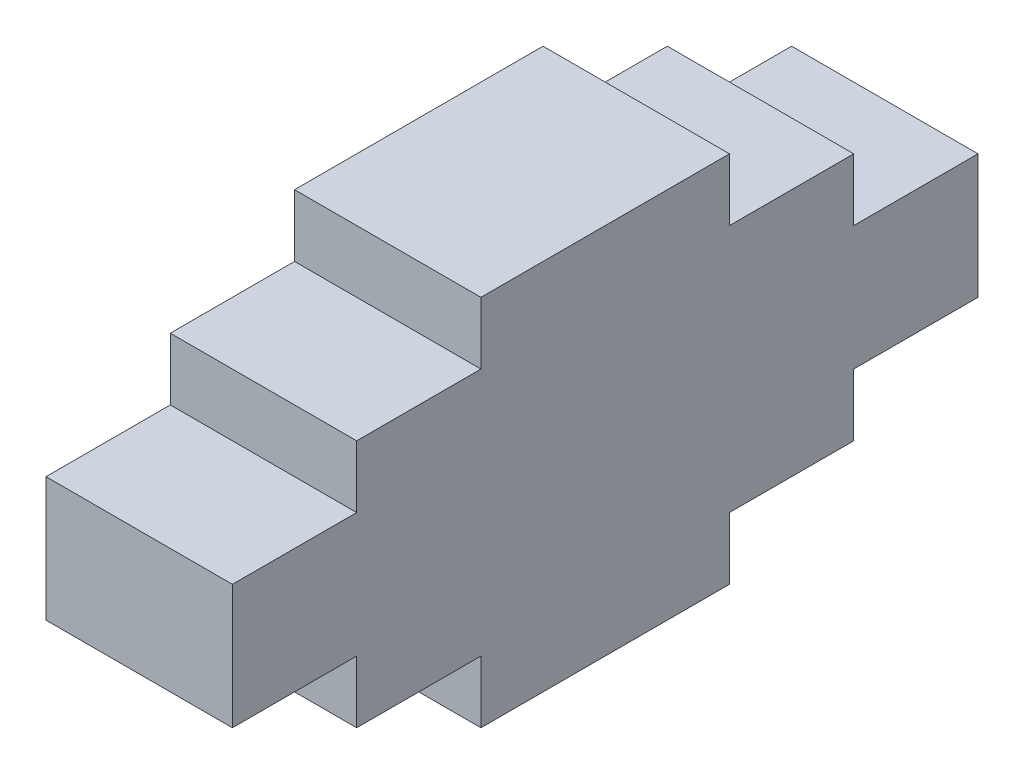
ISO-10303-21;
HEADER;
FILE_DESCRIPTION(('STEP AP214'),'2;1');
FILE_NAME('part.step','',(''),(''),'','','');
FILE_SCHEMA(('AUTOMOTIVE_DESIGN { 1 0 10303 214 1 1 1 1 }'));
ENDSEC;
DATA;
#1=APPLICATION_CONTEXT('core data for automotive mechanical design processes');
#2=APPLICATION_PROTOCOL_DEFINITION('international standard','automotive_design',2000,#1);
#3=PRODUCT_CONTEXT('',#1,'mechanical');
#4=PRODUCT('Part','Part','',(#3));
#5=PRODUCT_RELATED_PRODUCT_CATEGORY('part','',(#4));
#6=PRODUCT_DEFINITION_FORMATION('','',#4);
#7=PRODUCT_DEFINITION_CONTEXT('part definition',#1,'design');
#8=PRODUCT_DEFINITION('design','',#6,#7);
#9=PRODUCT_DEFINITION_SHAPE('','',#8);
#10=(LENGTH_UNIT() NAMED_UNIT(*) SI_UNIT(.MILLI.,.METRE.));
#11=(NAMED_UNIT(*) PLANE_ANGLE_UNIT() SI_UNIT($,.RADIAN.));
#12=(NAMED_UNIT(*) SI_UNIT($,.STERADIAN.) SOLID_ANGLE_UNIT());
#13=UNCERTAINTY_MEASURE_WITH_UNIT(LENGTH_MEASURE(1.E-05),#10,'distance_accuracy_value','');
#14=(GEOMETRIC_REPRESENTATION_CONTEXT(3) GLOBAL_UNCERTAINTY_ASSIGNED_CONTEXT((#13)) GLOBAL_UNIT_ASSIGNED_CONTEXT((#10,
#11,#12)) REPRESENTATION_CONTEXT('',''));
#15=CARTESIAN_POINT('',(0.,0.,0.));
#16=DIRECTION('',(0.,0.,1.));
#17=DIRECTION('',(1.,0.,0.));
#18=AXIS2_PLACEMENT_3D('',#15,#16,#17);
#19=CARTESIAN_POINT('',(30.,10.,60.));
#20=DIRECTION('',(0.,-1.,0.));
#21=DIRECTION('',(0.,0.,-1.));
#22=AXIS2_PLACEMENT_3D('',#19,#20,#21);
#23=PLANE('',#22);
#24=DIRECTION('',(0.,0.,1.));
#25=VECTOR('',#24,1.);
#26=CARTESIAN_POINT('',(0.,10.,60.));
#27=LINE('',#26,#25);
#28=CARTESIAN_POINT('',(0.,10.,40.));
#29=VERTEX_POINT('',#28);
#30=CARTESIAN_POINT('',(0.,10.,60.));
#31=VERTEX_POINT('',#30);
#32=EDGE_CURVE('E212',#29,#31,#27,.T.);
#33=ORIENTED_EDGE('',*,*,#32,.T.);
#34=DIRECTION('',(-1.,0.,0.));
#35=VECTOR('',#34,1.);
#36=CARTESIAN_POINT('',(30.,10.,60.));
#37=LINE('',#36,#35);
#38=CARTESIAN_POINT('',(30.,10.,60.));
#39=VERTEX_POINT('',#38);
#40=EDGE_CURVE('E11',#39,#31,#37,.T.);
#41=ORIENTED_EDGE('',*,*,#40,.F.);
#42=DIRECTION('',(0.,0.,1.));
#43=VECTOR('',#42,1.);
#44=CARTESIAN_POINT('',(30.,10.,60.));
#45=LINE('',#44,#43);
#46=CARTESIAN_POINT('',(30.,10.,40.));
#47=VERTEX_POINT('',#46);
#48=EDGE_CURVE('E270',#47,#39,#45,.T.);
#49=ORIENTED_EDGE('',*,*,#48,.F.);
#50=DIRECTION('',(-1.,0.,0.));
#51=VECTOR('',#50,1.);
#52=CARTESIAN_POINT('',(30.,10.,40.));
#53=LINE('',#52,#51);
#54=EDGE_CURVE('E208',#47,#29,#53,.T.);
#55=ORIENTED_EDGE('',*,*,#54,.T.);
#56=EDGE_LOOP('',(#33,#41,#49,#55));
#57=FACE_BOUND('',#56,.T.);
#58=ADVANCED_FACE('F39',(#57),#23,.F.);
#59=CARTESIAN_POINT('',(30.,-10.,60.));
#60=DIRECTION('',(0.,0.,-1.));
#61=DIRECTION('',(0.,1.,0.));
#62=AXIS2_PLACEMENT_3D('',#59,#60,#61);
#63=PLANE('',#62);
#64=DIRECTION('',(0.,-1.,0.));
#65=VECTOR('',#64,1.);
#66=CARTESIAN_POINT('',(0.,-10.,60.));
#67=LINE('',#66,#65);
#68=CARTESIAN_POINT('',(0.,-10.,60.));
#69=VERTEX_POINT('',#68);
#70=EDGE_CURVE('E216',#31,#69,#67,.T.);
#71=ORIENTED_EDGE('',*,*,#70,.T.);
#72=DIRECTION('',(-1.,0.,0.));
#73=VECTOR('',#72,1.);
#74=CARTESIAN_POINT('',(30.,-10.,60.));
#75=LINE('',#74,#73);
#76=CARTESIAN_POINT('',(30.,-10.,60.));
#77=VERTEX_POINT('',#76);
#78=EDGE_CURVE('E48',#77,#69,#75,.T.);
#79=ORIENTED_EDGE('',*,*,#78,.F.);
#80=DIRECTION('',(0.,-1.,0.));
#81=VECTOR('',#80,1.);
#82=CARTESIAN_POINT('',(30.,-10.,60.));
#83=LINE('',#82,#81);
#84=EDGE_CURVE('E135',#39,#77,#83,.T.);
#85=ORIENTED_EDGE('',*,*,#84,.F.);
#86=ORIENTED_EDGE('',*,*,#40,.T.);
#87=EDGE_LOOP('',(#71,#79,#85,#86));
#88=FACE_BOUND('',#87,.T.);
#89=ADVANCED_FACE('F420',(#88),#63,.F.);
#90=CARTESIAN_POINT('',(30.,-10.,60.));
#91=DIRECTION('',(0.,1.,0.));
#92=DIRECTION('',(0.,0.,1.));
#93=AXIS2_PLACEMENT_3D('',#90,#91,#92);
#94=PLANE('',#93);
#95=DIRECTION('',(0.,0.,-1.));
#96=VECTOR('',#95,1.);
#97=CARTESIAN_POINT('',(0.,-10.,60.));
#98=LINE('',#97,#96);
#99=CARTESIAN_POINT('',(0.,-10.,40.));
#100=VERTEX_POINT('',#99);
#101=EDGE_CURVE('E219',#69,#100,#98,.T.);
#102=ORIENTED_EDGE('',*,*,#101,.T.);
#103=DIRECTION('',(-1.,0.,0.));
#104=VECTOR('',#103,1.);
#105=CARTESIAN_POINT('',(30.,-10.,40.));
#106=LINE('',#105,#104);
#107=CARTESIAN_POINT('',(30.,-10.,40.));
#108=VERTEX_POINT('',#107);
#109=EDGE_CURVE('E329',#108,#100,#106,.T.);
#110=ORIENTED_EDGE('',*,*,#109,.F.);
#111=DIRECTION('',(0.,0.,-1.));
#112=VECTOR('',#111,1.);
#113=CARTESIAN_POINT('',(30.,-10.,60.));
#114=LINE('',#113,#112);
#115=EDGE_CURVE('E339',#77,#108,#114,.T.);
#116=ORIENTED_EDGE('',*,*,#115,.F.);
#117=ORIENTED_EDGE('',*,*,#78,.T.);
#118=EDGE_LOOP('',(#102,#110,#116,#117));
#119=FACE_BOUND('',#118,.T.);
#120=ADVANCED_FACE('F337',(#119),#94,.F.);
#121=CARTESIAN_POINT('',(30.,-10.,40.));
#122=DIRECTION('',(0.,0.,-1.));
#123=DIRECTION('',(-1.,0.,0.));
#124=AXIS2_PLACEMENT_3D('',#121,#122,#123);
#125=PLANE('',#124);
#126=DIRECTION('',(0.,-1.,0.));
#127=VECTOR('',#126,1.);
#128=CARTESIAN_POINT('',(0.,-10.,40.));
#129=LINE('',#128,#127);
#130=CARTESIAN_POINT('',(0.,-20.,40.));
#131=VERTEX_POINT('',#130);
#132=EDGE_CURVE('E222',#100,#131,#129,.T.);
#133=ORIENTED_EDGE('',*,*,#132,.T.);
#134=DIRECTION('',(-1.,0.,0.));
#135=VECTOR('',#134,1.);
#136=CARTESIAN_POINT('',(30.,-20.,40.));
#137=LINE('',#136,#135);
#138=CARTESIAN_POINT('',(30.,-20.,40.));
#139=VERTEX_POINT('',#138);
#140=EDGE_CURVE('E325',#139,#131,#137,.T.);
#141=ORIENTED_EDGE('',*,*,#140,.F.);
#142=DIRECTION('',(0.,-1.,0.));
#143=VECTOR('',#142,1.);
#144=CARTESIAN_POINT('',(30.,-10.,40.));
#145=LINE('',#144,#143);
#146=EDGE_CURVE('E358',#108,#139,#145,.T.);
#147=ORIENTED_EDGE('',*,*,#146,.F.);
#148=ORIENTED_EDGE('',*,*,#109,.T.);
#149=EDGE_LOOP('',(#133,#141,#147,#148));
#150=FACE_BOUND('',#149,.T.);
#151=ADVANCED_FACE('F348',(#150),#125,.F.);
#152=CARTESIAN_POINT('',(30.,-20.,40.));
#153=DIRECTION('',(0.,1.,0.));
#154=DIRECTION('',(0.,0.,1.));
#155=AXIS2_PLACEMENT_3D('',#152,#153,#154);
#156=PLANE('',#155);
#157=DIRECTION('',(0.,0.,-1.));
#158=VECTOR('',#157,1.);
#159=CARTESIAN_POINT('',(0.,-20.,40.));
#160=LINE('',#159,#158);
#161=CARTESIAN_POINT('',(0.,-20.,20.));
#162=VERTEX_POINT('',#161);
#163=EDGE_CURVE('E225',#131,#162,#160,.T.);
#164=ORIENTED_EDGE('',*,*,#163,.T.);
#165=DIRECTION('',(-1.,0.,0.));
#166=VECTOR('',#165,1.);
#167=CARTESIAN_POINT('',(30.,-20.,20.));
#168=LINE('',#167,#166);
#169=CARTESIAN_POINT('',(30.,-20.,20.));
#170=VERTEX_POINT('',#169);
#171=EDGE_CURVE('E321',#170,#162,#168,.T.);
#172=ORIENTED_EDGE('',*,*,#171,.F.);
#173=DIRECTION('',(0.,0.,-1.));
#174=VECTOR('',#173,1.);
#175=CARTESIAN_POINT('',(30.,-20.,40.));
#176=LINE('',#175,#174);
#177=EDGE_CURVE('E354',#139,#170,#176,.T.);
#178=ORIENTED_EDGE('',*,*,#177,.F.);
#179=ORIENTED_EDGE('',*,*,#140,.T.);
#180=EDGE_LOOP('',(#164,#172,#178,#179));
#181=FACE_BOUND('',#180,.T.);
#182=ADVANCED_FACE('F352',(#181),#156,.F.);
#183=CARTESIAN_POINT('',(30.,-20.,20.));
#184=DIRECTION('',(0.,0.,-1.));
#185=DIRECTION('',(-1.,0.,0.));
#186=AXIS2_PLACEMENT_3D('',#183,#184,#185);
#187=PLANE('',#186);
#188=DIRECTION('',(0.,-1.,0.));
#189=VECTOR('',#188,1.);
#190=CARTESIAN_POINT('',(0.,-20.,20.));
#191=LINE('',#190,#189);
#192=CARTESIAN_POINT('',(0.,-30.,20.));
#193=VERTEX_POINT('',#192);
#194=EDGE_CURVE('E228',#162,#193,#191,.T.);
#195=ORIENTED_EDGE('',*,*,#194,.T.);
#196=DIRECTION('',(-1.,0.,0.));
#197=VECTOR('',#196,1.);
#198=CARTESIAN_POINT('',(30.,-30.,20.));
#199=LINE('',#198,#197);
#200=CARTESIAN_POINT('',(30.,-30.,20.));
#201=VERTEX_POINT('',#200);
#202=EDGE_CURVE('E317',#201,#193,#199,.T.);
#203=ORIENTED_EDGE('',*,*,#202,.F.);
#204=DIRECTION('',(0.,-1.,0.));
#205=VECTOR('',#204,1.);
#206=CARTESIAN_POINT('',(30.,-20.,20.));
#207=LINE('',#206,#205);
#208=EDGE_CURVE('E357',#170,#201,#207,.T.);
#209=ORIENTED_EDGE('',*,*,#208,.F.);
#210=ORIENTED_EDGE('',*,*,#171,.T.);
#211=EDGE_LOOP('',(#195,#203,#209,#210));
#212=FACE_BOUND('',#211,.T.);
#213=ADVANCED_FACE('F433',(#212),#187,.F.);
#214=CARTESIAN_POINT('',(30.,-30.,20.));
#215=DIRECTION('',(0.,1.,0.));
#216=DIRECTION('',(0.,0.,1.));
#217=AXIS2_PLACEMENT_3D('',#214,#215,#216);
#218=PLANE('',#217);
#219=DIRECTION('',(0.,0.,-1.));
#220=VECTOR('',#219,1.);
#221=CARTESIAN_POINT('',(0.,-30.,20.));
#222=LINE('',#221,#220);
#223=CARTESIAN_POINT('',(0.,-30.,-19.9999999999999));
#224=VERTEX_POINT('',#223);
#225=EDGE_CURVE('E231',#193,#224,#222,.T.);
#226=ORIENTED_EDGE('',*,*,#225,.T.);
#227=DIRECTION('',(-1.,0.,0.));
#228=VECTOR('',#227,1.);
#229=CARTESIAN_POINT('',(30.,-30.,-19.9999999999999));
#230=LINE('',#229,#228);
#231=CARTESIAN_POINT('',(30.,-30.,-19.9999999999999));
#232=VERTEX_POINT('',#231);
#233=EDGE_CURVE('E313',#232,#224,#230,.T.);
#234=ORIENTED_EDGE('',*,*,#233,.F.);
#235=DIRECTION('',(0.,0.,-1.));
#236=VECTOR('',#235,1.);
#237=CARTESIAN_POINT('',(30.,-30.,20.));
#238=LINE('',#237,#236);
#239=EDGE_CURVE('E362',#201,#232,#238,.T.);
#240=ORIENTED_EDGE('',*,*,#239,.F.);
#241=ORIENTED_EDGE('',*,*,#202,.T.);
#242=EDGE_LOOP('',(#226,#234,#240,#241));
#243=FACE_BOUND('',#242,.T.);
#244=ADVANCED_FACE('F436',(#243),#218,.F.);
#245=CARTESIAN_POINT('',(30.,-20.,-19.9999999999999));
#246=DIRECTION('',(0.,0.,1.));
#247=DIRECTION('',(1.,0.,0.));
#248=AXIS2_PLACEMENT_3D('',#245,#246,#247);
#249=PLANE('',#248);
#250=DIRECTION('',(0.,1.,0.));
#251=VECTOR('',#250,1.);
#252=CARTESIAN_POINT('',(0.,-20.,-19.9999999999999));
#253=LINE('',#252,#251);
#254=CARTESIAN_POINT('',(0.,-20.,-19.9999999999999));
#255=VERTEX_POINT('',#254);
#256=EDGE_CURVE('E234',#224,#255,#253,.T.);
#257=ORIENTED_EDGE('',*,*,#256,.T.);
#258=DIRECTION('',(-1.,0.,0.));
#259=VECTOR('',#258,1.);
#260=CARTESIAN_POINT('',(30.,-20.,-19.9999999999999));
#261=LINE('',#260,#259);
#262=CARTESIAN_POINT('',(30.,-20.,-19.9999999999999));
#263=VERTEX_POINT('',#262);
#264=EDGE_CURVE('E309',#263,#255,#261,.T.);
#265=ORIENTED_EDGE('',*,*,#264,.F.);
#266=DIRECTION('',(0.,1.,0.));
#267=VECTOR('',#266,1.);
#268=CARTESIAN_POINT('',(30.,-20.,-19.9999999999999));
#269=LINE('',#268,#267);
#270=EDGE_CURVE('E369',#232,#263,#269,.T.);
#271=ORIENTED_EDGE('',*,*,#270,.F.);
#272=ORIENTED_EDGE('',*,*,#233,.T.);
#273=EDGE_LOOP('',(#257,#265,#271,#272));
#274=FACE_BOUND('',#273,.T.);
#275=ADVANCED_FACE('F440',(#274),#249,.F.);
#276=CARTESIAN_POINT('',(30.,-20.,-39.9999999999999));
#277=DIRECTION('',(0.,1.,0.));
#278=DIRECTION('',(0.,0.,1.));
#279=AXIS2_PLACEMENT_3D('',#276,#277,#278);
#280=PLANE('',#279);
#281=DIRECTION('',(0.,0.,-1.));
#282=VECTOR('',#281,1.);
#283=CARTESIAN_POINT('',(0.,-20.,-39.9999999999999));
#284=LINE('',#283,#282);
#285=CARTESIAN_POINT('',(0.,-20.,-39.9999999999999));
#286=VERTEX_POINT('',#285);
#287=EDGE_CURVE('E237',#255,#286,#284,.T.);
#288=ORIENTED_EDGE('',*,*,#287,.T.);
#289=DIRECTION('',(-1.,0.,0.));
#290=VECTOR('',#289,1.);
#291=CARTESIAN_POINT('',(30.,-20.,-39.9999999999999));
#292=LINE('',#291,#290);
#293=CARTESIAN_POINT('',(30.,-20.,-39.9999999999999));
#294=VERTEX_POINT('',#293);
#295=EDGE_CURVE('E305',#294,#286,#292,.T.);
#296=ORIENTED_EDGE('',*,*,#295,.F.);
#297=DIRECTION('',(0.,0.,-1.));
#298=VECTOR('',#297,1.);
#299=CARTESIAN_POINT('',(30.,-20.,-39.9999999999999));
#300=LINE('',#299,#298);
#301=EDGE_CURVE('E372',#263,#294,#300,.T.);
#302=ORIENTED_EDGE('',*,*,#301,.F.);
#303=ORIENTED_EDGE('',*,*,#264,.T.);
#304=EDGE_LOOP('',(#288,#296,#302,#303));
#305=FACE_BOUND('',#304,.T.);
#306=ADVANCED_FACE('F444',(#305),#280,.F.);
#307=CARTESIAN_POINT('',(30.,-10.,-39.9999999999999));
#308=DIRECTION('',(0.,0.,1.));
#309=DIRECTION('',(1.,0.,0.));
#310=AXIS2_PLACEMENT_3D('',#307,#308,#309);
#311=PLANE('',#310);
#312=DIRECTION('',(0.,1.,0.));
#313=VECTOR('',#312,1.);
#314=CARTESIAN_POINT('',(0.,-10.,-39.9999999999999));
#315=LINE('',#314,#313);
#316=CARTESIAN_POINT('',(0.,-10.,-39.9999999999999));
#317=VERTEX_POINT('',#316);
#318=EDGE_CURVE('E240',#286,#317,#315,.T.);
#319=ORIENTED_EDGE('',*,*,#318,.T.);
#320=DIRECTION('',(-1.,0.,0.));
#321=VECTOR('',#320,1.);
#322=CARTESIAN_POINT('',(30.,-10.,-39.9999999999999));
#323=LINE('',#322,#321);
#324=CARTESIAN_POINT('',(30.,-10.,-39.9999999999999));
#325=VERTEX_POINT('',#324);
#326=EDGE_CURVE('E301',#325,#317,#323,.T.);
#327=ORIENTED_EDGE('',*,*,#326,.F.);
#328=DIRECTION('',(0.,1.,0.));
#329=VECTOR('',#328,1.);
#330=CARTESIAN_POINT('',(30.,-10.,-39.9999999999999));
#331=LINE('',#330,#329);
#332=EDGE_CURVE('E375',#294,#325,#331,.T.);
#333=ORIENTED_EDGE('',*,*,#332,.F.);
#334=ORIENTED_EDGE('',*,*,#295,.T.);
#335=EDGE_LOOP('',(#319,#327,#333,#334));
#336=FACE_BOUND('',#335,.T.);
#337=ADVANCED_FACE('F448',(#336),#311,.F.);
#338=CARTESIAN_POINT('',(30.,-10.,-59.9999999999999));
#339=DIRECTION('',(0.,1.,0.));
#340=DIRECTION('',(0.,0.,1.));
#341=AXIS2_PLACEMENT_3D('',#338,#339,#340);
#342=PLANE('',#341);
#343=DIRECTION('',(0.,0.,-1.));
#344=VECTOR('',#343,1.);
#345=CARTESIAN_POINT('',(0.,-10.,-59.9999999999999));
#346=LINE('',#345,#344);
#347=CARTESIAN_POINT('',(0.,-10.,-59.9999999999999));
#348=VERTEX_POINT('',#347);
#349=EDGE_CURVE('E243',#317,#348,#346,.T.);
#350=ORIENTED_EDGE('',*,*,#349,.T.);
#351=DIRECTION('',(-1.,0.,0.));
#352=VECTOR('',#351,1.);
#353=CARTESIAN_POINT('',(30.,-10.,-59.9999999999999));
#354=LINE('',#353,#352);
#355=CARTESIAN_POINT('',(30.,-10.,-59.9999999999999));
#356=VERTEX_POINT('',#355);
#357=EDGE_CURVE('E297',#356,#348,#354,.T.);
#358=ORIENTED_EDGE('',*,*,#357,.F.);
#359=DIRECTION('',(0.,0.,-1.));
#360=VECTOR('',#359,1.);
#361=CARTESIAN_POINT('',(30.,-10.,-59.9999999999999));
#362=LINE('',#361,#360);
#363=EDGE_CURVE('E378',#325,#356,#362,.T.);
#364=ORIENTED_EDGE('',*,*,#363,.F.);
#365=ORIENTED_EDGE('',*,*,#326,.T.);
#366=EDGE_LOOP('',(#350,#358,#364,#365));
#367=FACE_BOUND('',#366,.T.);
#368=ADVANCED_FACE('F452',(#367),#342,.F.);
#369=CARTESIAN_POINT('',(30.,-10.,-59.9999999999999));
#370=DIRECTION('',(0.,0.,1.));
#371=DIRECTION('',(0.,-1.,0.));
#372=AXIS2_PLACEMENT_3D('',#369,#370,#371);
#373=PLANE('',#372);
#374=DIRECTION('',(0.,1.,0.));
#375=VECTOR('',#374,1.);
#376=CARTESIAN_POINT('',(0.,-10.,-59.9999999999999));
#377=LINE('',#376,#375);
#378=CARTESIAN_POINT('',(0.,10.,-60.));
#379=VERTEX_POINT('',#378);
#380=EDGE_CURVE('E246',#348,#379,#377,.T.);
#381=ORIENTED_EDGE('',*,*,#380,.T.);
#382=DIRECTION('',(-1.,0.,0.));
#383=VECTOR('',#382,1.);
#384=CARTESIAN_POINT('',(30.,10.,-60.));
#385=LINE('',#384,#383);
#386=CARTESIAN_POINT('',(30.,10.,-60.));
#387=VERTEX_POINT('',#386);
#388=EDGE_CURVE('E293',#387,#379,#385,.T.);
#389=ORIENTED_EDGE('',*,*,#388,.F.);
#390=DIRECTION('',(0.,1.,0.));
#391=VECTOR('',#390,1.);
#392=CARTESIAN_POINT('',(30.,-10.,-59.9999999999999));
#393=LINE('',#392,#391);
#394=EDGE_CURVE('E381',#356,#387,#393,.T.);
#395=ORIENTED_EDGE('',*,*,#394,.F.);
#396=ORIENTED_EDGE('',*,*,#357,.T.);
#397=EDGE_LOOP('',(#381,#389,#395,#396));
#398=FACE_BOUND('',#397,.T.);
#399=ADVANCED_FACE('F456',(#398),#373,.F.);
#400=CARTESIAN_POINT('',(30.,10.,-60.));
#401=DIRECTION('',(0.,-1.,0.));
#402=DIRECTION('',(0.,0.,-1.));
#403=AXIS2_PLACEMENT_3D('',#400,#401,#402);
#404=PLANE('',#403);
#405=DIRECTION('',(0.,0.,1.));
#406=VECTOR('',#405,1.);
#407=CARTESIAN_POINT('',(0.,10.,-60.));
#408=LINE('',#407,#406);
#409=CARTESIAN_POINT('',(0.,10.,-40.));
#410=VERTEX_POINT('',#409);
#411=EDGE_CURVE('E249',#379,#410,#408,.T.);
#412=ORIENTED_EDGE('',*,*,#411,.T.);
#413=DIRECTION('',(-1.,0.,0.));
#414=VECTOR('',#413,1.);
#415=CARTESIAN_POINT('',(30.,10.,-40.));
#416=LINE('',#415,#414);
#417=CARTESIAN_POINT('',(30.,10.,-40.));
#418=VERTEX_POINT('',#417);
#419=EDGE_CURVE('E289',#418,#410,#416,.T.);
#420=ORIENTED_EDGE('',*,*,#419,.F.);
#421=DIRECTION('',(0.,0.,1.));
#422=VECTOR('',#421,1.);
#423=CARTESIAN_POINT('',(30.,10.,-60.));
#424=LINE('',#423,#422);
#425=EDGE_CURVE('E384',#387,#418,#424,.T.);
#426=ORIENTED_EDGE('',*,*,#425,.F.);
#427=ORIENTED_EDGE('',*,*,#388,.T.);
#428=EDGE_LOOP('',(#412,#420,#426,#427));
#429=FACE_BOUND('',#428,.T.);
#430=ADVANCED_FACE('F460',(#429),#404,.F.);
#431=CARTESIAN_POINT('',(30.,10.,-40.));
#432=DIRECTION('',(0.,0.,1.));
#433=DIRECTION('',(1.,0.,0.));
#434=AXIS2_PLACEMENT_3D('',#431,#432,#433);
#435=PLANE('',#434);
#436=DIRECTION('',(0.,1.,0.));
#437=VECTOR('',#436,1.);
#438=CARTESIAN_POINT('',(0.,10.,-40.));
#439=LINE('',#438,#437);
#440=CARTESIAN_POINT('',(0.,20.,-40.));
#441=VERTEX_POINT('',#440);
#442=EDGE_CURVE('E252',#410,#441,#439,.T.);
#443=ORIENTED_EDGE('',*,*,#442,.T.);
#444=DIRECTION('',(-1.,0.,0.));
#445=VECTOR('',#444,1.);
#446=CARTESIAN_POINT('',(30.,20.,-40.));
#447=LINE('',#446,#445);
#448=CARTESIAN_POINT('',(30.,20.,-40.));
#449=VERTEX_POINT('',#448);
#450=EDGE_CURVE('E285',#449,#441,#447,.T.);
#451=ORIENTED_EDGE('',*,*,#450,.F.);
#452=DIRECTION('',(0.,1.,0.));
#453=VECTOR('',#452,1.);
#454=CARTESIAN_POINT('',(30.,10.,-40.));
#455=LINE('',#454,#453);
#456=EDGE_CURVE('E387',#418,#449,#455,.T.);
#457=ORIENTED_EDGE('',*,*,#456,.F.);
#458=ORIENTED_EDGE('',*,*,#419,.T.);
#459=EDGE_LOOP('',(#443,#451,#457,#458));
#460=FACE_BOUND('',#459,.T.);
#461=ADVANCED_FACE('F464',(#460),#435,.F.);
#462=CARTESIAN_POINT('',(30.,20.,-40.));
#463=DIRECTION('',(0.,-1.,0.));
#464=DIRECTION('',(0.,0.,-1.));
#465=AXIS2_PLACEMENT_3D('',#462,#463,#464);
#466=PLANE('',#465);
#467=DIRECTION('',(0.,0.,1.));
#468=VECTOR('',#467,1.);
#469=CARTESIAN_POINT('',(0.,20.,-40.));
#470=LINE('',#469,#468);
#471=CARTESIAN_POINT('',(0.,20.,-20.));
#472=VERTEX_POINT('',#471);
#473=EDGE_CURVE('E255',#441,#472,#470,.T.);
#474=ORIENTED_EDGE('',*,*,#473,.T.);
#475=DIRECTION('',(-1.,0.,0.));
#476=VECTOR('',#475,1.);
#477=CARTESIAN_POINT('',(30.,20.,-20.));
#478=LINE('',#477,#476);
#479=CARTESIAN_POINT('',(30.,20.,-20.));
#480=VERTEX_POINT('',#479);
#481=EDGE_CURVE('E281',#480,#472,#478,.T.);
#482=ORIENTED_EDGE('',*,*,#481,.F.);
#483=DIRECTION('',(0.,0.,1.));
#484=VECTOR('',#483,1.);
#485=CARTESIAN_POINT('',(30.,20.,-40.));
#486=LINE('',#485,#484);
#487=EDGE_CURVE('E390',#449,#480,#486,.T.);
#488=ORIENTED_EDGE('',*,*,#487,.F.);
#489=ORIENTED_EDGE('',*,*,#450,.T.);
#490=EDGE_LOOP('',(#474,#482,#488,#489));
#491=FACE_BOUND('',#490,.T.);
#492=ADVANCED_FACE('F468',(#491),#466,.F.);
#493=CARTESIAN_POINT('',(30.,20.,-20.));
#494=DIRECTION('',(0.,0.,1.));
#495=DIRECTION('',(1.,0.,0.));
#496=AXIS2_PLACEMENT_3D('',#493,#494,#495);
#497=PLANE('',#496);
#498=DIRECTION('',(0.,1.,0.));
#499=VECTOR('',#498,1.);
#500=CARTESIAN_POINT('',(0.,20.,-20.));
#501=LINE('',#500,#499);
#502=CARTESIAN_POINT('',(0.,30.,-20.));
#503=VERTEX_POINT('',#502);
#504=EDGE_CURVE('E258',#472,#503,#501,.T.);
#505=ORIENTED_EDGE('',*,*,#504,.T.);
#506=DIRECTION('',(-1.,0.,0.));
#507=VECTOR('',#506,1.);
#508=CARTESIAN_POINT('',(30.,30.,-20.));
#509=LINE('',#508,#507);
#510=CARTESIAN_POINT('',(30.,30.,-20.));
#511=VERTEX_POINT('',#510);
#512=EDGE_CURVE('E277',#511,#503,#509,.T.);
#513=ORIENTED_EDGE('',*,*,#512,.F.);
#514=DIRECTION('',(0.,1.,0.));
#515=VECTOR('',#514,1.);
#516=CARTESIAN_POINT('',(30.,20.,-20.));
#517=LINE('',#516,#515);
#518=EDGE_CURVE('E393',#480,#511,#517,.T.);
#519=ORIENTED_EDGE('',*,*,#518,.F.);
#520=ORIENTED_EDGE('',*,*,#481,.T.);
#521=EDGE_LOOP('',(#505,#513,#519,#520));
#522=FACE_BOUND('',#521,.T.);
#523=ADVANCED_FACE('F401',(#522),#497,.F.);
#524=CARTESIAN_POINT('',(30.,30.,20.));
#525=DIRECTION('',(0.,-1.,0.));
#526=DIRECTION('',(0.,0.,-1.));
#527=AXIS2_PLACEMENT_3D('',#524,#525,#526);
#528=PLANE('',#527);
#529=DIRECTION('',(0.,0.,1.));
#530=VECTOR('',#529,1.);
#531=CARTESIAN_POINT('',(0.,30.,20.));
#532=LINE('',#531,#530);
#533=CARTESIAN_POINT('',(0.,30.,20.));
#534=VERTEX_POINT('',#533);
#535=EDGE_CURVE('E261',#503,#534,#532,.T.);
#536=ORIENTED_EDGE('',*,*,#535,.T.);
#537=DIRECTION('',(-1.,0.,0.));
#538=VECTOR('',#537,1.);
#539=CARTESIAN_POINT('',(30.,30.,20.));
#540=LINE('',#539,#538);
#541=CARTESIAN_POINT('',(30.,30.,20.));
#542=VERTEX_POINT('',#541);
#543=EDGE_CURVE('E201',#542,#534,#540,.T.);
#544=ORIENTED_EDGE('',*,*,#543,.F.);
#545=DIRECTION('',(0.,0.,1.));
#546=VECTOR('',#545,1.);
#547=CARTESIAN_POINT('',(30.,30.,20.));
#548=LINE('',#547,#546);
#549=EDGE_CURVE('E190',#511,#542,#548,.T.);
#550=ORIENTED_EDGE('',*,*,#549,.F.);
#551=ORIENTED_EDGE('',*,*,#512,.T.);
#552=EDGE_LOOP('',(#536,#544,#550,#551));
#553=FACE_BOUND('',#552,.T.);
#554=ADVANCED_FACE('F405',(#553),#528,.F.);
#555=CARTESIAN_POINT('',(30.,20.,20.));
#556=DIRECTION('',(0.,0.,-1.));
#557=DIRECTION('',(-1.,0.,0.));
#558=AXIS2_PLACEMENT_3D('',#555,#556,#557);
#559=PLANE('',#558);
#560=DIRECTION('',(0.,-1.,0.));
#561=VECTOR('',#560,1.);
#562=CARTESIAN_POINT('',(0.,20.,20.));
#563=LINE('',#562,#561);
#564=CARTESIAN_POINT('',(0.,20.,20.));
#565=VERTEX_POINT('',#564);
#566=EDGE_CURVE('E199',#534,#565,#563,.T.);
#567=ORIENTED_EDGE('',*,*,#566,.T.);
#568=DIRECTION('',(-1.,0.,0.));
#569=VECTOR('',#568,1.);
#570=CARTESIAN_POINT('',(30.,20.,20.));
#571=LINE('',#570,#569);
#572=CARTESIAN_POINT('',(30.,20.,20.));
#573=VERTEX_POINT('',#572);
#574=EDGE_CURVE('E196',#573,#565,#571,.T.);
#575=ORIENTED_EDGE('',*,*,#574,.F.);
#576=DIRECTION('',(0.,-1.,0.));
#577=VECTOR('',#576,1.);
#578=CARTESIAN_POINT('',(30.,20.,20.));
#579=LINE('',#578,#577);
#580=EDGE_CURVE('E184',#542,#573,#579,.T.);
#581=ORIENTED_EDGE('',*,*,#580,.F.);
#582=ORIENTED_EDGE('',*,*,#543,.T.);
#583=EDGE_LOOP('',(#567,#575,#581,#582));
#584=FACE_BOUND('',#583,.T.);
#585=ADVANCED_FACE('F197',(#584),#559,.F.);
#586=CARTESIAN_POINT('',(30.,20.,40.));
#587=DIRECTION('',(0.,-1.,0.));
#588=DIRECTION('',(0.,0.,-1.));
#589=AXIS2_PLACEMENT_3D('',#586,#587,#588);
#590=PLANE('',#589);
#591=DIRECTION('',(0.,0.,1.));
#592=VECTOR('',#591,1.);
#593=CARTESIAN_POINT('',(0.,20.,40.));
#594=LINE('',#593,#592);
#595=CARTESIAN_POINT('',(0.,20.,40.));
#596=VERTEX_POINT('',#595);
#597=EDGE_CURVE('E121',#565,#596,#594,.T.);
#598=ORIENTED_EDGE('',*,*,#597,.T.);
#599=DIRECTION('',(-1.,0.,0.));
#600=VECTOR('',#599,1.);
#601=CARTESIAN_POINT('',(30.,20.,40.));
#602=LINE('',#601,#600);
#603=CARTESIAN_POINT('',(30.,20.,40.));
#604=VERTEX_POINT('',#603);
#605=EDGE_CURVE('E202',#604,#596,#602,.T.);
#606=ORIENTED_EDGE('',*,*,#605,.F.);
#607=DIRECTION('',(0.,0.,1.));
#608=VECTOR('',#607,1.);
#609=CARTESIAN_POINT('',(30.,20.,40.));
#610=LINE('',#609,#608);
#611=EDGE_CURVE('E188',#573,#604,#610,.T.);
#612=ORIENTED_EDGE('',*,*,#611,.F.);
#613=ORIENTED_EDGE('',*,*,#574,.T.);
#614=EDGE_LOOP('',(#598,#606,#612,#613));
#615=FACE_BOUND('',#614,.T.);
#616=ADVANCED_FACE('F204',(#615),#590,.F.);
#617=CARTESIAN_POINT('',(30.,10.,40.));
#618=DIRECTION('',(0.,0.,-1.));
#619=DIRECTION('',(-1.,0.,0.));
#620=AXIS2_PLACEMENT_3D('',#617,#618,#619);
#621=PLANE('',#620);
#622=DIRECTION('',(0.,-1.,0.));
#623=VECTOR('',#622,1.);
#624=CARTESIAN_POINT('',(0.,10.,40.));
#625=LINE('',#624,#623);
#626=EDGE_CURVE('E127',#596,#29,#625,.T.);
#627=ORIENTED_EDGE('',*,*,#626,.T.);
#628=ORIENTED_EDGE('',*,*,#54,.F.);
#629=DIRECTION('',(0.,-1.,0.));
#630=VECTOR('',#629,1.);
#631=CARTESIAN_POINT('',(30.,10.,40.));
#632=LINE('',#631,#630);
#633=EDGE_CURVE('E56',#604,#47,#632,.T.);
#634=ORIENTED_EDGE('',*,*,#633,.F.);
#635=ORIENTED_EDGE('',*,*,#605,.T.);
#636=EDGE_LOOP('',(#627,#628,#634,#635));
#637=FACE_BOUND('',#636,.T.);
#638=ADVANCED_FACE('F409',(#637),#621,.F.);
#639=CARTESIAN_POINT('',(30.,0.,0.));
#640=DIRECTION('',(1.,0.,0.));
#641=DIRECTION('',(0.,0.,-1.));
#642=AXIS2_PLACEMENT_3D('',#639,#640,#641);
#643=PLANE('',#642);
#644=ORIENTED_EDGE('',*,*,#48,.T.);
#645=ORIENTED_EDGE('',*,*,#84,.T.);
#646=ORIENTED_EDGE('',*,*,#115,.T.);
#647=ORIENTED_EDGE('',*,*,#146,.T.);
#648=ORIENTED_EDGE('',*,*,#177,.T.);
#649=ORIENTED_EDGE('',*,*,#208,.T.);
#650=ORIENTED_EDGE('',*,*,#239,.T.);
#651=ORIENTED_EDGE('',*,*,#270,.T.);
#652=ORIENTED_EDGE('',*,*,#301,.T.);
#653=ORIENTED_EDGE('',*,*,#332,.T.);
#654=ORIENTED_EDGE('',*,*,#363,.T.);
#655=ORIENTED_EDGE('',*,*,#394,.T.);
#656=ORIENTED_EDGE('',*,*,#425,.T.);
#657=ORIENTED_EDGE('',*,*,#456,.T.);
#658=ORIENTED_EDGE('',*,*,#487,.T.);
#659=ORIENTED_EDGE('',*,*,#518,.T.);
#660=ORIENTED_EDGE('',*,*,#549,.T.);
#661=ORIENTED_EDGE('',*,*,#580,.T.);
#662=ORIENTED_EDGE('',*,*,#611,.T.);
#663=ORIENTED_EDGE('',*,*,#633,.T.);
#664=EDGE_LOOP('',(#644,#645,#646,#647,#648,#649,#650,#651,#652,#653,#654,#655,#656,#657,#658,
#659,#660,#661,#662,#663));
#665=FACE_BOUND('',#664,.T.);
#666=ADVANCED_FACE('F186',(#665),#643,.T.);
#667=CARTESIAN_POINT('',(0.,0.,0.));
#668=DIRECTION('',(1.,0.,0.));
#669=DIRECTION('',(0.,0.,-1.));
#670=AXIS2_PLACEMENT_3D('',#667,#668,#669);
#671=PLANE('',#670);
#672=ORIENTED_EDGE('',*,*,#32,.F.);
#673=ORIENTED_EDGE('',*,*,#626,.F.);
#674=ORIENTED_EDGE('',*,*,#597,.F.);
#675=ORIENTED_EDGE('',*,*,#566,.F.);
#676=ORIENTED_EDGE('',*,*,#535,.F.);
#677=ORIENTED_EDGE('',*,*,#504,.F.);
#678=ORIENTED_EDGE('',*,*,#473,.F.);
#679=ORIENTED_EDGE('',*,*,#442,.F.);
#680=ORIENTED_EDGE('',*,*,#411,.F.);
#681=ORIENTED_EDGE('',*,*,#380,.F.);
#682=ORIENTED_EDGE('',*,*,#349,.F.);
#683=ORIENTED_EDGE('',*,*,#318,.F.);
#684=ORIENTED_EDGE('',*,*,#287,.F.);
#685=ORIENTED_EDGE('',*,*,#256,.F.);
#686=ORIENTED_EDGE('',*,*,#225,.F.);
#687=ORIENTED_EDGE('',*,*,#194,.F.);
#688=ORIENTED_EDGE('',*,*,#163,.F.);
#689=ORIENTED_EDGE('',*,*,#132,.F.);
#690=ORIENTED_EDGE('',*,*,#101,.F.);
#691=ORIENTED_EDGE('',*,*,#70,.F.);
#692=EDGE_LOOP('',(#672,#673,#674,#675,#676,#677,#678,#679,#680,#681,#682,#683,#684,#685,#686,
#687,#688,#689,#690,#691));
#693=FACE_BOUND('',#692,.T.);
#694=ADVANCED_FACE('F343',(#693),#671,.F.);
#695=CLOSED_SHELL('',(#58,#89,#120,#151,#182,#213,#244,#275,#306,#337,#368,#399,#430,#461,#492,
#523,#554,#585,#616,#638,#666,#694));
#696=MANIFOLD_SOLID_BREP('B2',#695);
#697=ADVANCED_BREP_SHAPE_REPRESENTATION('',(#18,#696),#14);
#698=SHAPE_DEFINITION_REPRESENTATION(#9,#697);
ENDSEC;
END-ISO-10303-21;
